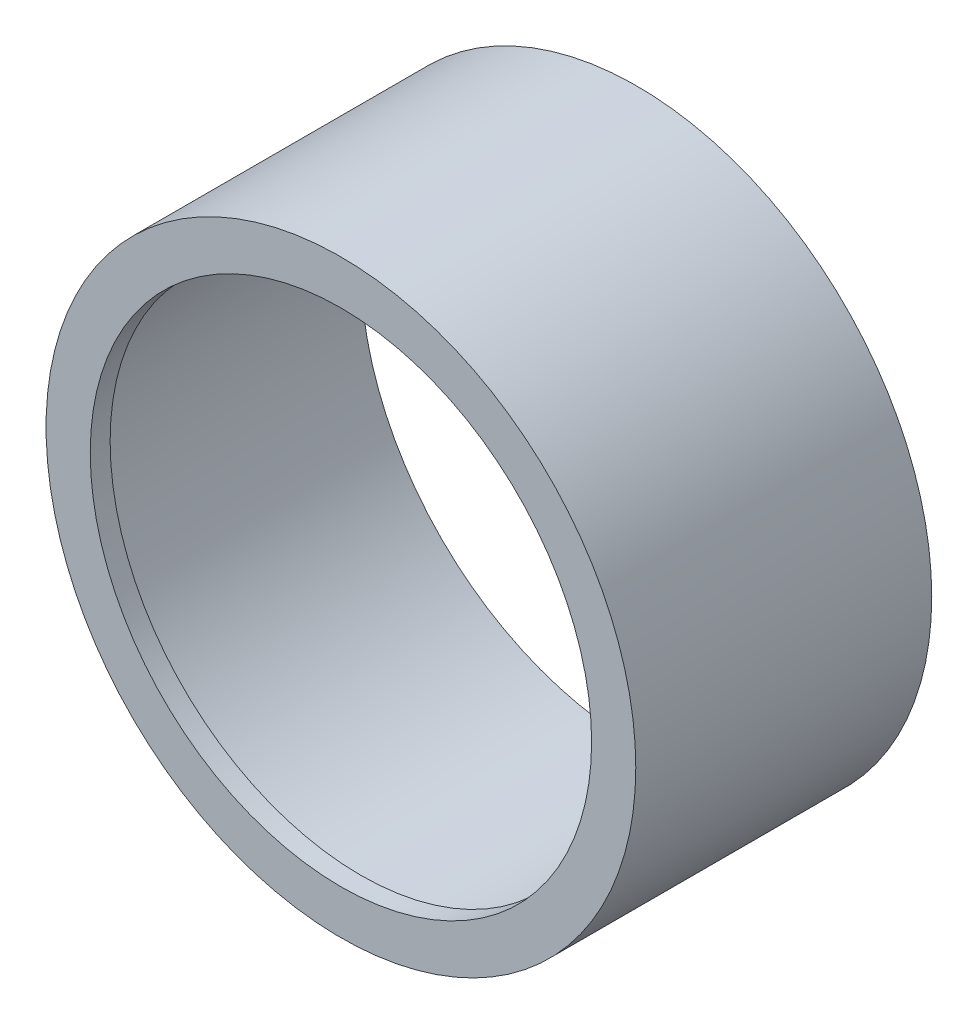
ISO-10303-21;
HEADER;
FILE_DESCRIPTION(('STEP AP214'),'2;1');
FILE_NAME('part.step','',(''),(''),'','','');
FILE_SCHEMA(('AUTOMOTIVE_DESIGN { 1 0 10303 214 1 1 1 1 }'));
ENDSEC;
DATA;
#1=APPLICATION_CONTEXT('core data for automotive mechanical design processes');
#2=APPLICATION_PROTOCOL_DEFINITION('international standard','automotive_design',2000,#1);
#3=PRODUCT_CONTEXT('',#1,'mechanical');
#4=PRODUCT('Part','Part','',(#3));
#5=PRODUCT_RELATED_PRODUCT_CATEGORY('part','',(#4));
#6=PRODUCT_DEFINITION_FORMATION('','',#4);
#7=PRODUCT_DEFINITION_CONTEXT('part definition',#1,'design');
#8=PRODUCT_DEFINITION('design','',#6,#7);
#9=PRODUCT_DEFINITION_SHAPE('','',#8);
#10=(LENGTH_UNIT() NAMED_UNIT(*) SI_UNIT(.MILLI.,.METRE.));
#11=(NAMED_UNIT(*) PLANE_ANGLE_UNIT() SI_UNIT($,.RADIAN.));
#12=(NAMED_UNIT(*) SI_UNIT($,.STERADIAN.) SOLID_ANGLE_UNIT());
#13=UNCERTAINTY_MEASURE_WITH_UNIT(LENGTH_MEASURE(1.E-05),#10,'distance_accuracy_value','');
#14=(GEOMETRIC_REPRESENTATION_CONTEXT(3) GLOBAL_UNCERTAINTY_ASSIGNED_CONTEXT((#13)) GLOBAL_UNIT_ASSIGNED_CONTEXT((#10,
#11,#12)) REPRESENTATION_CONTEXT('',''));
#15=CARTESIAN_POINT('',(0.,0.,0.));
#16=DIRECTION('',(0.,0.,1.));
#17=DIRECTION('',(1.,0.,0.));
#18=AXIS2_PLACEMENT_3D('',#15,#16,#17);
#19=CARTESIAN_POINT('',(0.,0.,-100.519004230723));
#20=DIRECTION('',(0.,0.,1.));
#21=DIRECTION('',(1.,0.,0.));
#22=AXIS2_PLACEMENT_3D('',#19,#20,#21);
#23=CYLINDRICAL_SURFACE('',#22,26.7);
#24=CARTESIAN_POINT('',(0.,0.,-25.));
#25=DIRECTION('',(0.,0.,1.));
#26=DIRECTION('',(1.,0.,0.));
#27=AXIS2_PLACEMENT_3D('',#24,#25,#26);
#28=CIRCLE('',#27,26.7);
#29=CARTESIAN_POINT('',(26.7,0.,-25.));
#30=VERTEX_POINT('',#29);
#31=EDGE_CURVE('E10',#30,#30,#28,.F.);
#32=ORIENTED_EDGE('',*,*,#31,.F.);
#33=EDGE_LOOP('',(#32));
#34=FACE_BOUND('',#33,.T.);
#35=CARTESIAN_POINT('',(0.,0.,1.8));
#36=DIRECTION('',(0.,0.,1.));
#37=DIRECTION('',(1.,0.,0.));
#38=AXIS2_PLACEMENT_3D('',#35,#36,#37);
#39=CIRCLE('',#38,26.7);
#40=CARTESIAN_POINT('',(26.7,0.,1.8));
#41=VERTEX_POINT('',#40);
#42=EDGE_CURVE('E48',#41,#41,#39,.T.);
#43=ORIENTED_EDGE('',*,*,#42,.F.);
#44=EDGE_LOOP('',(#43));
#45=FACE_BOUND('',#44,.T.);
#46=ADVANCED_FACE('F35',(#34,#45),#23,.T.);
#47=CARTESIAN_POINT('',(0.,0.,-100.519004230723));
#48=DIRECTION('',(0.,0.,1.));
#49=DIRECTION('',(1.,0.,0.));
#50=AXIS2_PLACEMENT_3D('',#47,#48,#49);
#51=CYLINDRICAL_SURFACE('',#50,25.);
#52=CARTESIAN_POINT('',(0.,0.,-25.));
#53=DIRECTION('',(0.,0.,1.));
#54=DIRECTION('',(1.,0.,0.));
#55=AXIS2_PLACEMENT_3D('',#52,#53,#54);
#56=CIRCLE('',#55,25.);
#57=CARTESIAN_POINT('',(25.,0.,-25.));
#58=VERTEX_POINT('',#57);
#59=EDGE_CURVE('E38',#58,#58,#56,.F.);
#60=ORIENTED_EDGE('',*,*,#59,.T.);
#61=EDGE_LOOP('',(#60));
#62=FACE_BOUND('',#61,.T.);
#63=CARTESIAN_POINT('',(0.,0.,0.));
#64=DIRECTION('',(0.,0.,1.));
#65=DIRECTION('',(1.,0.,0.));
#66=AXIS2_PLACEMENT_3D('',#63,#64,#65);
#67=CIRCLE('',#66,25.);
#68=CARTESIAN_POINT('',(25.,0.,0.));
#69=VERTEX_POINT('',#68);
#70=EDGE_CURVE('E46',#69,#69,#67,.T.);
#71=ORIENTED_EDGE('',*,*,#70,.T.);
#72=EDGE_LOOP('',(#71));
#73=FACE_BOUND('',#72,.T.);
#74=ADVANCED_FACE('F77',(#62,#73),#51,.F.);
#75=CARTESIAN_POINT('',(0.,0.,-25.));
#76=DIRECTION('',(0.,0.,1.));
#77=DIRECTION('',(1.,0.,0.));
#78=AXIS2_PLACEMENT_3D('',#75,#76,#77);
#79=PLANE('',#78);
#80=ORIENTED_EDGE('',*,*,#31,.T.);
#81=EDGE_LOOP('',(#80));
#82=FACE_BOUND('',#81,.T.);
#83=ORIENTED_EDGE('',*,*,#59,.F.);
#84=EDGE_LOOP('',(#83));
#85=FACE_BOUND('',#84,.T.);
#86=ADVANCED_FACE('F82',(#82,#85),#79,.F.);
#87=CARTESIAN_POINT('',(0.,0.,0.));
#88=DIRECTION('',(0.,0.,1.));
#89=DIRECTION('',(1.,0.,0.));
#90=AXIS2_PLACEMENT_3D('',#87,#88,#89);
#91=PLANE('',#90);
#92=CARTESIAN_POINT('',(0.,0.,0.));
#93=DIRECTION('',(0.,0.,1.));
#94=DIRECTION('',(1.,0.,0.));
#95=AXIS2_PLACEMENT_3D('',#92,#93,#94);
#96=CIRCLE('',#95,22.7);
#97=CARTESIAN_POINT('',(22.7,0.,0.));
#98=VERTEX_POINT('',#97);
#99=EDGE_CURVE('E58',#98,#98,#96,.T.);
#100=ORIENTED_EDGE('',*,*,#99,.T.);
#101=EDGE_LOOP('',(#100));
#102=FACE_BOUND('',#101,.T.);
#103=ORIENTED_EDGE('',*,*,#70,.F.);
#104=EDGE_LOOP('',(#103));
#105=FACE_BOUND('',#104,.T.);
#106=ADVANCED_FACE('F65',(#102,#105),#91,.F.);
#107=CARTESIAN_POINT('',(0.,0.,1.8));
#108=DIRECTION('',(0.,0.,1.));
#109=DIRECTION('',(1.,0.,0.));
#110=AXIS2_PLACEMENT_3D('',#107,#108,#109);
#111=PLANE('',#110);
#112=ORIENTED_EDGE('',*,*,#42,.T.);
#113=EDGE_LOOP('',(#112));
#114=FACE_BOUND('',#113,.T.);
#115=CARTESIAN_POINT('',(0.,0.,1.8));
#116=DIRECTION('',(0.,0.,1.));
#117=DIRECTION('',(1.,0.,0.));
#118=AXIS2_PLACEMENT_3D('',#115,#116,#117);
#119=CIRCLE('',#118,22.7);
#120=CARTESIAN_POINT('',(22.7,0.,1.8));
#121=VERTEX_POINT('',#120);
#122=EDGE_CURVE('E54',#121,#121,#119,.T.);
#123=ORIENTED_EDGE('',*,*,#122,.F.);
#124=EDGE_LOOP('',(#123));
#125=FACE_BOUND('',#124,.T.);
#126=ADVANCED_FACE('F70',(#114,#125),#111,.T.);
#127=CARTESIAN_POINT('',(0.,0.,1.8));
#128=DIRECTION('',(0.,0.,-1.));
#129=DIRECTION('',(-1.,0.,0.));
#130=AXIS2_PLACEMENT_3D('',#127,#128,#129);
#131=CYLINDRICAL_SURFACE('',#130,22.7);
#132=ORIENTED_EDGE('',*,*,#122,.T.);
#133=EDGE_LOOP('',(#132));
#134=FACE_BOUND('',#133,.T.);
#135=ORIENTED_EDGE('',*,*,#99,.F.);
#136=EDGE_LOOP('',(#135));
#137=FACE_BOUND('',#136,.T.);
#138=ADVANCED_FACE('F68',(#134,#137),#131,.F.);
#139=CLOSED_SHELL('',(#46,#74,#86,#106,#126,#138));
#140=MANIFOLD_SOLID_BREP('B2',#139);
#141=ADVANCED_BREP_SHAPE_REPRESENTATION('',(#18,#140),#14);
#142=SHAPE_DEFINITION_REPRESENTATION(#9,#141);
ENDSEC;
END-ISO-10303-21;
